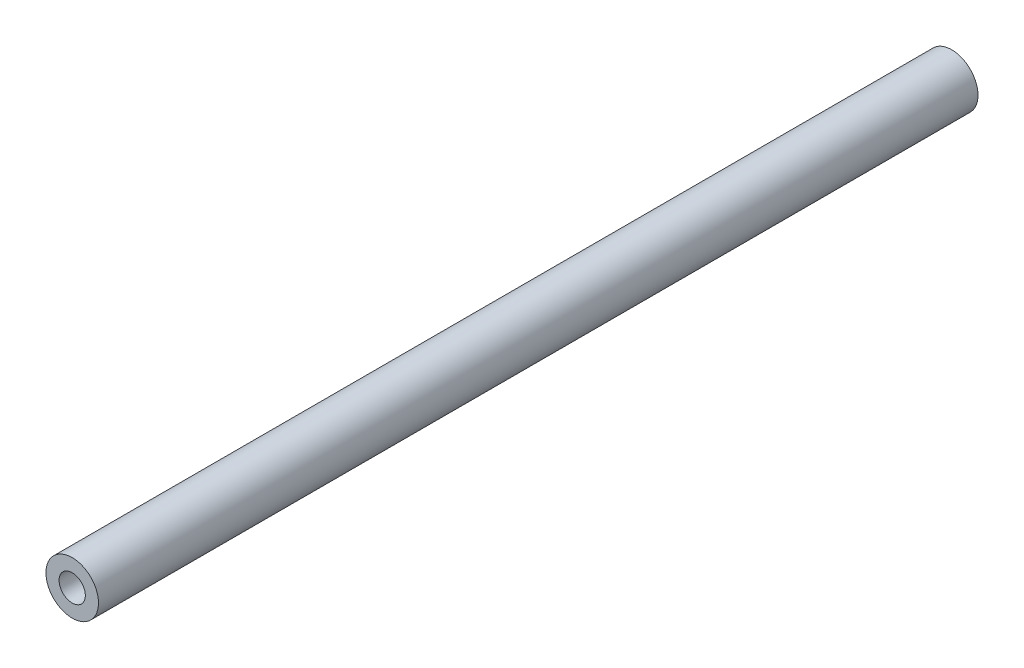
ISO-10303-21;
HEADER;
FILE_DESCRIPTION(('STEP AP214'),'2;1');
FILE_NAME('part.step','',(''),(''),'','','');
FILE_SCHEMA(('AUTOMOTIVE_DESIGN { 1 0 10303 214 1 1 1 1 }'));
ENDSEC;
DATA;
#1=APPLICATION_CONTEXT('core data for automotive mechanical design processes');
#2=APPLICATION_PROTOCOL_DEFINITION('international standard','automotive_design',2000,#1);
#3=PRODUCT_CONTEXT('',#1,'mechanical');
#4=PRODUCT('Part','Part','',(#3));
#5=PRODUCT_RELATED_PRODUCT_CATEGORY('part','',(#4));
#6=PRODUCT_DEFINITION_FORMATION('','',#4);
#7=PRODUCT_DEFINITION_CONTEXT('part definition',#1,'design');
#8=PRODUCT_DEFINITION('design','',#6,#7);
#9=PRODUCT_DEFINITION_SHAPE('','',#8);
#10=(LENGTH_UNIT() NAMED_UNIT(*) SI_UNIT(.MILLI.,.METRE.));
#11=(NAMED_UNIT(*) PLANE_ANGLE_UNIT() SI_UNIT($,.RADIAN.));
#12=(NAMED_UNIT(*) SI_UNIT($,.STERADIAN.) SOLID_ANGLE_UNIT());
#13=UNCERTAINTY_MEASURE_WITH_UNIT(LENGTH_MEASURE(1.E-05),#10,'distance_accuracy_value','');
#14=(GEOMETRIC_REPRESENTATION_CONTEXT(3) GLOBAL_UNCERTAINTY_ASSIGNED_CONTEXT((#13)) GLOBAL_UNIT_ASSIGNED_CONTEXT((#10,
#11,#12)) REPRESENTATION_CONTEXT('',''));
#15=CARTESIAN_POINT('',(0.,0.,0.));
#16=DIRECTION('',(0.,0.,1.));
#17=DIRECTION('',(1.,0.,0.));
#18=AXIS2_PLACEMENT_3D('',#15,#16,#17);
#19=CARTESIAN_POINT('',(0.,0.,134.));
#20=DIRECTION('',(0.,0.,-1.));
#21=DIRECTION('',(-1.,0.,0.));
#22=AXIS2_PLACEMENT_3D('',#19,#20,#21);
#23=CYLINDRICAL_SURFACE('',#22,4.);
#24=CARTESIAN_POINT('',(0.,0.,134.));
#25=DIRECTION('',(0.,0.,1.));
#26=DIRECTION('',(1.,0.,0.));
#27=AXIS2_PLACEMENT_3D('',#24,#25,#26);
#28=CIRCLE('',#27,4.);
#29=CARTESIAN_POINT('',(4.,0.,134.));
#30=VERTEX_POINT('',#29);
#31=EDGE_CURVE('E10',#30,#30,#28,.T.);
#32=ORIENTED_EDGE('',*,*,#31,.F.);
#33=EDGE_LOOP('',(#32));
#34=FACE_BOUND('',#33,.T.);
#35=CARTESIAN_POINT('',(0.,0.,0.));
#36=DIRECTION('',(0.,0.,1.));
#37=DIRECTION('',(1.,0.,0.));
#38=AXIS2_PLACEMENT_3D('',#35,#36,#37);
#39=CIRCLE('',#38,4.);
#40=CARTESIAN_POINT('',(4.,0.,0.));
#41=VERTEX_POINT('',#40);
#42=EDGE_CURVE('E33',#41,#41,#39,.T.);
#43=ORIENTED_EDGE('',*,*,#42,.T.);
#44=EDGE_LOOP('',(#43));
#45=FACE_BOUND('',#44,.T.);
#46=ADVANCED_FACE('F30',(#34,#45),#23,.T.);
#47=CARTESIAN_POINT('',(0.,0.,134.));
#48=DIRECTION('',(0.,0.,1.));
#49=DIRECTION('',(1.,0.,0.));
#50=AXIS2_PLACEMENT_3D('',#47,#48,#49);
#51=PLANE('',#50);
#52=CARTESIAN_POINT('',(0.,0.,134.));
#53=DIRECTION('',(0.,0.,1.));
#54=DIRECTION('',(1.,0.,0.));
#55=AXIS2_PLACEMENT_3D('',#52,#53,#54);
#56=CIRCLE('',#55,2.);
#57=CARTESIAN_POINT('',(2.,0.,134.));
#58=VERTEX_POINT('',#57);
#59=EDGE_CURVE('E42',#58,#58,#56,.T.);
#60=ORIENTED_EDGE('',*,*,#59,.F.);
#61=EDGE_LOOP('',(#60));
#62=FACE_BOUND('',#61,.T.);
#63=ORIENTED_EDGE('',*,*,#31,.T.);
#64=EDGE_LOOP('',(#63));
#65=FACE_BOUND('',#64,.T.);
#66=ADVANCED_FACE('F67',(#62,#65),#51,.T.);
#67=CARTESIAN_POINT('',(0.,0.,0.));
#68=DIRECTION('',(0.,0.,1.));
#69=DIRECTION('',(1.,0.,0.));
#70=AXIS2_PLACEMENT_3D('',#67,#68,#69);
#71=PLANE('',#70);
#72=CARTESIAN_POINT('',(0.,0.,0.));
#73=DIRECTION('',(0.,0.,-1.));
#74=DIRECTION('',(-1.,0.,0.));
#75=AXIS2_PLACEMENT_3D('',#72,#73,#74);
#76=CIRCLE('',#75,2.);
#77=CARTESIAN_POINT('',(-2.,0.,0.));
#78=VERTEX_POINT('',#77);
#79=EDGE_CURVE('E48',#78,#78,#76,.T.);
#80=ORIENTED_EDGE('',*,*,#79,.F.);
#81=EDGE_LOOP('',(#80));
#82=FACE_BOUND('',#81,.T.);
#83=ORIENTED_EDGE('',*,*,#42,.F.);
#84=EDGE_LOOP('',(#83));
#85=FACE_BOUND('',#84,.T.);
#86=ADVANCED_FACE('F63',(#82,#85),#71,.F.);
#87=CARTESIAN_POINT('',(0.,0.,124.));
#88=DIRECTION('',(0.,0.,1.));
#89=DIRECTION('',(1.,0.,0.));
#90=AXIS2_PLACEMENT_3D('',#87,#88,#89);
#91=CYLINDRICAL_SURFACE('',#90,2.);
#92=CARTESIAN_POINT('',(0.,0.,124.));
#93=DIRECTION('',(0.,0.,1.));
#94=DIRECTION('',(1.,0.,0.));
#95=AXIS2_PLACEMENT_3D('',#92,#93,#94);
#96=CIRCLE('',#95,2.);
#97=CARTESIAN_POINT('',(2.,0.,124.));
#98=VERTEX_POINT('',#97);
#99=EDGE_CURVE('E40',#98,#98,#96,.T.);
#100=ORIENTED_EDGE('',*,*,#99,.F.);
#101=EDGE_LOOP('',(#100));
#102=FACE_BOUND('',#101,.T.);
#103=ORIENTED_EDGE('',*,*,#59,.T.);
#104=EDGE_LOOP('',(#103));
#105=FACE_BOUND('',#104,.T.);
#106=ADVANCED_FACE('F66',(#102,#105),#91,.F.);
#107=CARTESIAN_POINT('',(0.,0.,124.));
#108=DIRECTION('',(0.,0.,1.));
#109=DIRECTION('',(1.,0.,0.));
#110=AXIS2_PLACEMENT_3D('',#107,#108,#109);
#111=PLANE('',#110);
#112=ORIENTED_EDGE('',*,*,#99,.T.);
#113=EDGE_LOOP('',(#112));
#114=FACE_BOUND('',#113,.T.);
#115=ADVANCED_FACE('F59',(#114),#111,.T.);
#116=CARTESIAN_POINT('',(0.,0.,10.));
#117=DIRECTION('',(0.,0.,-1.));
#118=DIRECTION('',(-1.,0.,0.));
#119=AXIS2_PLACEMENT_3D('',#116,#117,#118);
#120=CYLINDRICAL_SURFACE('',#119,2.);
#121=CARTESIAN_POINT('',(0.,0.,10.));
#122=DIRECTION('',(0.,0.,-1.));
#123=DIRECTION('',(-1.,0.,0.));
#124=AXIS2_PLACEMENT_3D('',#121,#122,#123);
#125=CIRCLE('',#124,2.);
#126=CARTESIAN_POINT('',(-2.,0.,10.));
#127=VERTEX_POINT('',#126);
#128=EDGE_CURVE('E45',#127,#127,#125,.T.);
#129=ORIENTED_EDGE('',*,*,#128,.F.);
#130=EDGE_LOOP('',(#129));
#131=FACE_BOUND('',#130,.T.);
#132=ORIENTED_EDGE('',*,*,#79,.T.);
#133=EDGE_LOOP('',(#132));
#134=FACE_BOUND('',#133,.T.);
#135=ADVANCED_FACE('F56',(#131,#134),#120,.F.);
#136=CARTESIAN_POINT('',(0.,0.,10.));
#137=DIRECTION('',(0.,0.,-1.));
#138=DIRECTION('',(-1.,0.,0.));
#139=AXIS2_PLACEMENT_3D('',#136,#137,#138);
#140=PLANE('',#139);
#141=ORIENTED_EDGE('',*,*,#128,.T.);
#142=EDGE_LOOP('',(#141));
#143=FACE_BOUND('',#142,.T.);
#144=ADVANCED_FACE('F54',(#143),#140,.T.);
#145=CLOSED_SHELL('',(#46,#66,#86,#106,#115,#135,#144));
#146=MANIFOLD_SOLID_BREP('B2',#145);
#147=ADVANCED_BREP_SHAPE_REPRESENTATION('',(#18,#146),#14);
#148=SHAPE_DEFINITION_REPRESENTATION(#9,#147);
ENDSEC;
END-ISO-10303-21;
